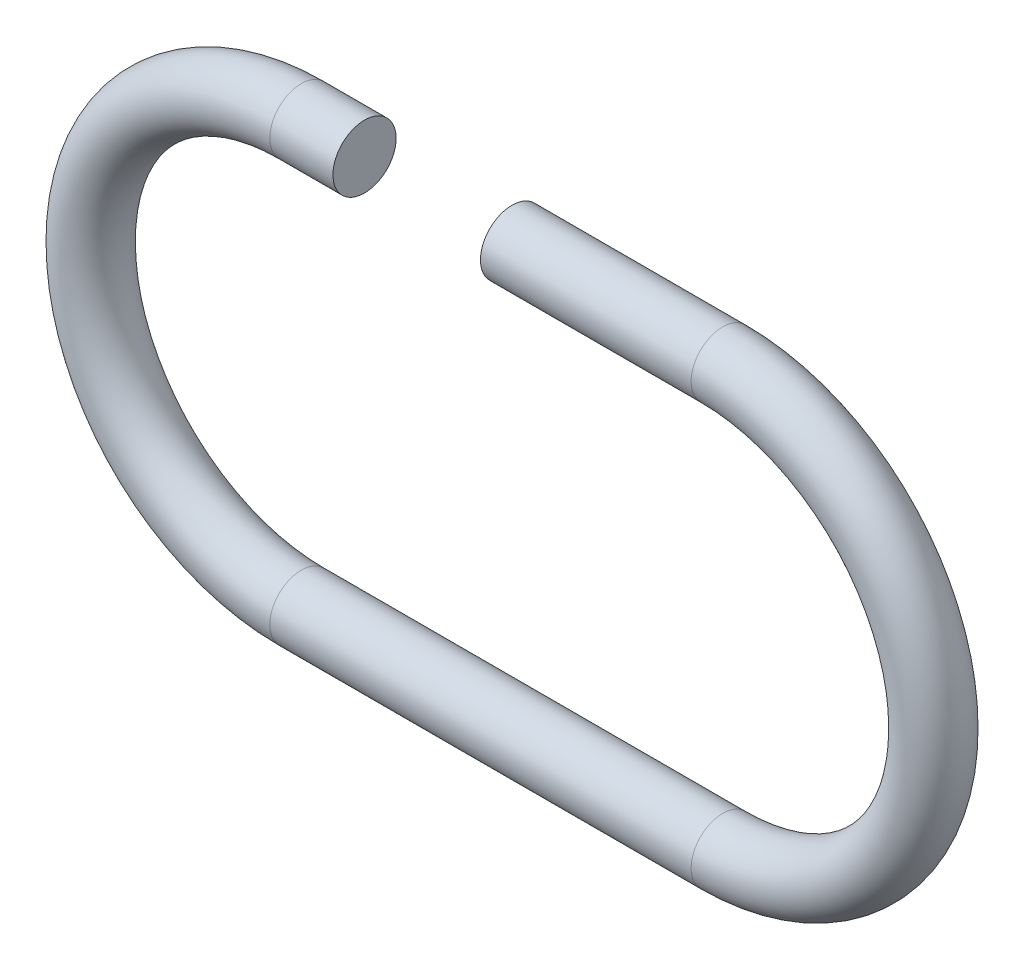
ISO-10303-21;
HEADER;
FILE_DESCRIPTION(('STEP AP214'),'2;1');
FILE_NAME('part.step','',(''),(''),'','','');
FILE_SCHEMA(('AUTOMOTIVE_DESIGN { 1 0 10303 214 1 1 1 1 }'));
ENDSEC;
DATA;
#1=APPLICATION_CONTEXT('core data for automotive mechanical design processes');
#2=APPLICATION_PROTOCOL_DEFINITION('international standard','automotive_design',2000,#1);
#3=PRODUCT_CONTEXT('',#1,'mechanical');
#4=PRODUCT('Part','Part','',(#3));
#5=PRODUCT_RELATED_PRODUCT_CATEGORY('part','',(#4));
#6=PRODUCT_DEFINITION_FORMATION('','',#4);
#7=PRODUCT_DEFINITION_CONTEXT('part definition',#1,'design');
#8=PRODUCT_DEFINITION('design','',#6,#7);
#9=PRODUCT_DEFINITION_SHAPE('','',#8);
#10=(LENGTH_UNIT() NAMED_UNIT(*) SI_UNIT(.MILLI.,.METRE.));
#11=(NAMED_UNIT(*) PLANE_ANGLE_UNIT() SI_UNIT($,.RADIAN.));
#12=(NAMED_UNIT(*) SI_UNIT($,.STERADIAN.) SOLID_ANGLE_UNIT());
#13=UNCERTAINTY_MEASURE_WITH_UNIT(LENGTH_MEASURE(1.E-05),#10,'distance_accuracy_value','');
#14=(GEOMETRIC_REPRESENTATION_CONTEXT(3) GLOBAL_UNCERTAINTY_ASSIGNED_CONTEXT((#13)) GLOBAL_UNIT_ASSIGNED_CONTEXT((#10,
#11,#12)) REPRESENTATION_CONTEXT('',''));
#15=CARTESIAN_POINT('',(0.,0.,0.));
#16=DIRECTION('',(0.,0.,1.));
#17=DIRECTION('',(1.,0.,0.));
#18=AXIS2_PLACEMENT_3D('',#15,#16,#17);
#19=CARTESIAN_POINT('',(0.,0.,0.));
#20=DIRECTION('',(1.,0.,0.));
#21=DIRECTION('',(0.,0.,-1.));
#22=AXIS2_PLACEMENT_3D('',#19,#20,#21);
#23=PLANE('',#22);
#24=CARTESIAN_POINT('',(0.,0.,0.));
#25=DIRECTION('',(1.,0.,0.));
#26=DIRECTION('',(0.,0.,-1.));
#27=AXIS2_PLACEMENT_3D('',#24,#25,#26);
#28=CIRCLE('',#27,1.5);
#29=CARTESIAN_POINT('',(0.,0.,-1.5));
#30=VERTEX_POINT('',#29);
#31=EDGE_CURVE('E64',#30,#30,#28,.T.);
#32=ORIENTED_EDGE('',*,*,#31,.F.);
#33=EDGE_LOOP('',(#32));
#34=FACE_BOUND('',#33,.T.);
#35=ADVANCED_FACE('F37',(#34),#23,.F.);
#36=CARTESIAN_POINT('',(-7.,0.,0.));
#37=DIRECTION('',(1.,0.,0.));
#38=DIRECTION('',(0.,0.,-1.));
#39=AXIS2_PLACEMENT_3D('',#36,#37,#38);
#40=PLANE('',#39);
#41=CARTESIAN_POINT('',(-7.,0.,0.));
#42=DIRECTION('',(1.,0.,0.));
#43=DIRECTION('',(0.,0.,-1.));
#44=AXIS2_PLACEMENT_3D('',#41,#42,#43);
#45=CIRCLE('',#44,1.5);
#46=CARTESIAN_POINT('',(-7.,0.,-1.5));
#47=VERTEX_POINT('',#46);
#48=EDGE_CURVE('E10',#47,#47,#45,.T.);
#49=ORIENTED_EDGE('',*,*,#48,.T.);
#50=EDGE_LOOP('',(#49));
#51=FACE_BOUND('',#50,.T.);
#52=ADVANCED_FACE('F72',(#51),#40,.T.);
#53=CARTESIAN_POINT('',(0.,0.,0.));
#54=DIRECTION('',(1.,0.,0.));
#55=DIRECTION('',(0.,0.,-1.));
#56=AXIS2_PLACEMENT_3D('',#53,#54,#55);
#57=CYLINDRICAL_SURFACE('',#56,1.5);
#58=CARTESIAN_POINT('',(10.,0.,0.));
#59=DIRECTION('',(1.,0.,0.));
#60=DIRECTION('',(0.,0.,-1.));
#61=AXIS2_PLACEMENT_3D('',#58,#59,#60);
#62=CIRCLE('',#61,1.5);
#63=CARTESIAN_POINT('',(10.,1.5,0.));
#64=VERTEX_POINT('',#63);
#65=EDGE_CURVE('E60',#64,#64,#62,.T.);
#66=ORIENTED_EDGE('',*,*,#65,.F.);
#67=EDGE_LOOP('',(#66));
#68=FACE_BOUND('',#67,.T.);
#69=ORIENTED_EDGE('',*,*,#31,.T.);
#70=EDGE_LOOP('',(#69));
#71=FACE_BOUND('',#70,.T.);
#72=ADVANCED_FACE('F69',(#68,#71),#57,.T.);
#73=CARTESIAN_POINT('',(10.,-10.,0.));
#74=DIRECTION('',(0.,0.,-1.));
#75=DIRECTION('',(-1.,0.,0.));
#76=AXIS2_PLACEMENT_3D('',#73,#74,#75);
#77=TOROIDAL_SURFACE('',#76,10.,1.5);
#78=CARTESIAN_POINT('',(10.,-20.,0.));
#79=DIRECTION('',(-1.,0.,0.));
#80=DIRECTION('',(0.,0.,-1.));
#81=AXIS2_PLACEMENT_3D('',#78,#79,#80);
#82=CIRCLE('',#81,1.5);
#83=CARTESIAN_POINT('',(10.,-21.5,0.));
#84=VERTEX_POINT('',#83);
#85=EDGE_CURVE('E54',#84,#84,#82,.T.);
#86=CARTESIAN_POINT('',(10.,-10.,0.));
#87=DIRECTION('',(0.,0.,-1.));
#88=DIRECTION('',(-1.,0.,0.));
#89=AXIS2_PLACEMENT_3D('',#86,#87,#88);
#90=CIRCLE('',#89,11.5);
#91=EDGE_CURVE('',#64,#84,#90,.T.);
#92=ORIENTED_EDGE('',*,*,#65,.T.);
#93=ORIENTED_EDGE('',*,*,#85,.F.);
#94=ORIENTED_EDGE('',*,*,#91,.T.);
#95=ORIENTED_EDGE('',*,*,#91,.F.);
#96=EDGE_LOOP('',(#92,#94,#93,#95));
#97=FACE_BOUND('',#96,.T.);
#98=ADVANCED_FACE('F90',(#97),#77,.T.);
#99=CARTESIAN_POINT('',(10.,-20.,0.));
#100=DIRECTION('',(-1.,0.,0.));
#101=DIRECTION('',(0.,-1.,0.));
#102=AXIS2_PLACEMENT_3D('',#99,#100,#101);
#103=CYLINDRICAL_SURFACE('',#102,1.5);
#104=CARTESIAN_POINT('',(-10.,-20.,0.));
#105=DIRECTION('',(-1.,0.,0.));
#106=DIRECTION('',(0.,0.,-1.));
#107=AXIS2_PLACEMENT_3D('',#104,#105,#106);
#108=CIRCLE('',#107,1.5);
#109=CARTESIAN_POINT('',(-10.,-21.5,0.));
#110=VERTEX_POINT('',#109);
#111=EDGE_CURVE('E49',#110,#110,#108,.T.);
#112=ORIENTED_EDGE('',*,*,#111,.F.);
#113=EDGE_LOOP('',(#112));
#114=FACE_BOUND('',#113,.T.);
#115=ORIENTED_EDGE('',*,*,#85,.T.);
#116=EDGE_LOOP('',(#115));
#117=FACE_BOUND('',#116,.T.);
#118=ADVANCED_FACE('F84',(#114,#117),#103,.T.);
#119=CARTESIAN_POINT('',(-10.,-10.,0.));
#120=DIRECTION('',(0.,0.,-1.));
#121=DIRECTION('',(-1.,0.,0.));
#122=AXIS2_PLACEMENT_3D('',#119,#120,#121);
#123=TOROIDAL_SURFACE('',#122,10.,1.5);
#124=CARTESIAN_POINT('',(-10.,0.,0.));
#125=DIRECTION('',(1.,0.,0.));
#126=DIRECTION('',(0.,0.,-1.));
#127=AXIS2_PLACEMENT_3D('',#124,#125,#126);
#128=CIRCLE('',#127,1.5);
#129=CARTESIAN_POINT('',(-10.,1.5,0.));
#130=VERTEX_POINT('',#129);
#131=EDGE_CURVE('E44',#130,#130,#128,.T.);
#132=CARTESIAN_POINT('',(-10.,-10.,0.));
#133=DIRECTION('',(0.,0.,-1.));
#134=DIRECTION('',(-1.,0.,0.));
#135=AXIS2_PLACEMENT_3D('',#132,#133,#134);
#136=CIRCLE('',#135,11.5);
#137=EDGE_CURVE('',#110,#130,#136,.T.);
#138=ORIENTED_EDGE('',*,*,#111,.T.);
#139=ORIENTED_EDGE('',*,*,#131,.F.);
#140=ORIENTED_EDGE('',*,*,#137,.T.);
#141=ORIENTED_EDGE('',*,*,#137,.F.);
#142=EDGE_LOOP('',(#138,#140,#139,#141));
#143=FACE_BOUND('',#142,.T.);
#144=ADVANCED_FACE('F78',(#143),#123,.T.);
#145=CARTESIAN_POINT('',(-10.,0.,0.));
#146=DIRECTION('',(1.,0.,0.));
#147=DIRECTION('',(0.,0.,-1.));
#148=AXIS2_PLACEMENT_3D('',#145,#146,#147);
#149=CYLINDRICAL_SURFACE('',#148,1.5);
#150=ORIENTED_EDGE('',*,*,#48,.F.);
#151=EDGE_LOOP('',(#150));
#152=FACE_BOUND('',#151,.T.);
#153=ORIENTED_EDGE('',*,*,#131,.T.);
#154=EDGE_LOOP('',(#153));
#155=FACE_BOUND('',#154,.T.);
#156=ADVANCED_FACE('F76',(#152,#155),#149,.T.);
#157=CLOSED_SHELL('',(#35,#52,#72,#98,#118,#144,#156));
#158=MANIFOLD_SOLID_BREP('B2',#157);
#159=ADVANCED_BREP_SHAPE_REPRESENTATION('',(#18,#158),#14);
#160=SHAPE_DEFINITION_REPRESENTATION(#9,#159);
ENDSEC;
END-ISO-10303-21;
